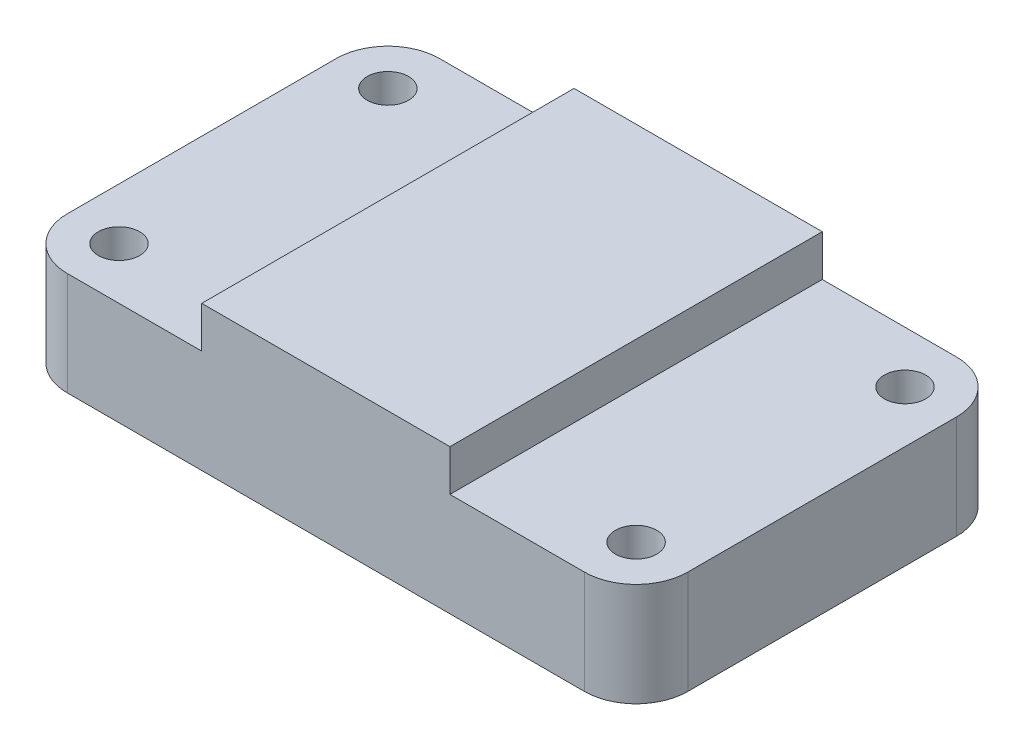
ISO-10303-21;
HEADER;
FILE_DESCRIPTION(('STEP AP214'),'2;1');
FILE_NAME('part.step','',(''),(''),'','','');
FILE_SCHEMA(('AUTOMOTIVE_DESIGN { 1 0 10303 214 1 1 1 1 }'));
ENDSEC;
DATA;
#1=APPLICATION_CONTEXT('core data for automotive mechanical design processes');
#2=APPLICATION_PROTOCOL_DEFINITION('international standard','automotive_design',2000,#1);
#3=PRODUCT_CONTEXT('',#1,'mechanical');
#4=PRODUCT('Part','Part','',(#3));
#5=PRODUCT_RELATED_PRODUCT_CATEGORY('part','',(#4));
#6=PRODUCT_DEFINITION_FORMATION('','',#4);
#7=PRODUCT_DEFINITION_CONTEXT('part definition',#1,'design');
#8=PRODUCT_DEFINITION('design','',#6,#7);
#9=PRODUCT_DEFINITION_SHAPE('','',#8);
#10=(LENGTH_UNIT() NAMED_UNIT(*) SI_UNIT(.MILLI.,.METRE.));
#11=(NAMED_UNIT(*) PLANE_ANGLE_UNIT() SI_UNIT($,.RADIAN.));
#12=(NAMED_UNIT(*) SI_UNIT($,.STERADIAN.) SOLID_ANGLE_UNIT());
#13=UNCERTAINTY_MEASURE_WITH_UNIT(LENGTH_MEASURE(1.E-05),#10,'distance_accuracy_value','');
#14=(GEOMETRIC_REPRESENTATION_CONTEXT(3) GLOBAL_UNCERTAINTY_ASSIGNED_CONTEXT((#13)) GLOBAL_UNIT_ASSIGNED_CONTEXT((#10,
#11,#12)) REPRESENTATION_CONTEXT('',''));
#15=CARTESIAN_POINT('',(0.,0.,0.));
#16=DIRECTION('',(0.,0.,1.));
#17=DIRECTION('',(1.,0.,0.));
#18=AXIS2_PLACEMENT_3D('',#15,#16,#17);
#19=CARTESIAN_POINT('',(0.,50.,-90.));
#20=DIRECTION('',(0.,0.,1.));
#21=DIRECTION('',(1.,0.,0.));
#22=AXIS2_PLACEMENT_3D('',#19,#20,#21);
#23=PLANE('',#22);
#24=DIRECTION('',(-1.,0.,0.));
#25=VECTOR('',#24,1.);
#26=CARTESIAN_POINT('',(0.,0.,-90.));
#27=LINE('',#26,#25);
#28=CARTESIAN_POINT('',(125.,0.,-90.));
#29=VERTEX_POINT('',#28);
#30=CARTESIAN_POINT('',(-125.,0.,-90.));
#31=VERTEX_POINT('',#30);
#32=EDGE_CURVE('E132',#29,#31,#27,.T.);
#33=ORIENTED_EDGE('',*,*,#32,.T.);
#34=DIRECTION('',(0.,-1.,0.));
#35=VECTOR('',#34,1.);
#36=CARTESIAN_POINT('',(-125.,50.,-90.));
#37=LINE('',#36,#35);
#38=CARTESIAN_POINT('',(-125.,50.,-90.));
#39=VERTEX_POINT('',#38);
#40=EDGE_CURVE('E11',#39,#31,#37,.T.);
#41=ORIENTED_EDGE('',*,*,#40,.F.);
#42=DIRECTION('',(-1.,0.,0.));
#43=VECTOR('',#42,1.);
#44=CARTESIAN_POINT('',(0.,50.,-90.));
#45=LINE('',#44,#43);
#46=CARTESIAN_POINT('',(-60.,50.,-90.));
#47=VERTEX_POINT('',#46);
#48=EDGE_CURVE('E62',#47,#39,#45,.T.);
#49=ORIENTED_EDGE('',*,*,#48,.F.);
#50=DIRECTION('',(0.,-1.,0.));
#51=VECTOR('',#50,1.);
#52=CARTESIAN_POINT('',(-60.,70.,-90.));
#53=LINE('',#52,#51);
#54=CARTESIAN_POINT('',(-60.,70.,-90.));
#55=VERTEX_POINT('',#54);
#56=EDGE_CURVE('E200',#55,#47,#53,.T.);
#57=ORIENTED_EDGE('',*,*,#56,.F.);
#58=DIRECTION('',(-1.,0.,0.));
#59=VECTOR('',#58,1.);
#60=CARTESIAN_POINT('',(0.,70.,-90.));
#61=LINE('',#60,#59);
#62=CARTESIAN_POINT('',(60.,70.,-90.));
#63=VERTEX_POINT('',#62);
#64=EDGE_CURVE('E186',#63,#55,#61,.T.);
#65=ORIENTED_EDGE('',*,*,#64,.F.);
#66=DIRECTION('',(0.,-1.,0.));
#67=VECTOR('',#66,1.);
#68=CARTESIAN_POINT('',(60.,70.,-90.));
#69=LINE('',#68,#67);
#70=CARTESIAN_POINT('',(60.,50.,-90.));
#71=VERTEX_POINT('',#70);
#72=EDGE_CURVE('E129',#63,#71,#69,.T.);
#73=ORIENTED_EDGE('',*,*,#72,.T.);
#74=DIRECTION('',(-1.,0.,0.));
#75=VECTOR('',#74,1.);
#76=CARTESIAN_POINT('',(0.,50.,-90.));
#77=LINE('',#76,#75);
#78=CARTESIAN_POINT('',(125.,50.,-90.));
#79=VERTEX_POINT('',#78);
#80=EDGE_CURVE('E237',#79,#71,#77,.T.);
#81=ORIENTED_EDGE('',*,*,#80,.F.);
#82=DIRECTION('',(0.,-1.,0.));
#83=VECTOR('',#82,1.);
#84=CARTESIAN_POINT('',(125.,50.,-90.));
#85=LINE('',#84,#83);
#86=EDGE_CURVE('E172',#79,#29,#85,.T.);
#87=ORIENTED_EDGE('',*,*,#86,.T.);
#88=EDGE_LOOP('',(#33,#41,#49,#57,#65,#73,#81,#87));
#89=FACE_BOUND('',#88,.T.);
#90=ADVANCED_FACE('F38',(#89),#23,.F.);
#91=CARTESIAN_POINT('',(-125.,50.,-65.));
#92=DIRECTION('',(0.,-1.,0.));
#93=DIRECTION('',(0.,0.,-1.));
#94=AXIS2_PLACEMENT_3D('',#91,#92,#93);
#95=CYLINDRICAL_SURFACE('',#94,25.);
#96=CARTESIAN_POINT('',(-125.,0.,-65.));
#97=DIRECTION('',(0.,1.,0.));
#98=DIRECTION('',(0.,0.,1.));
#99=AXIS2_PLACEMENT_3D('',#96,#97,#98);
#100=CIRCLE('',#99,25.);
#101=CARTESIAN_POINT('',(-150.,0.,-65.));
#102=VERTEX_POINT('',#101);
#103=EDGE_CURVE('E135',#31,#102,#100,.T.);
#104=ORIENTED_EDGE('',*,*,#103,.T.);
#105=DIRECTION('',(0.,-1.,0.));
#106=VECTOR('',#105,1.);
#107=CARTESIAN_POINT('',(-150.,50.,-65.));
#108=LINE('',#107,#106);
#109=CARTESIAN_POINT('',(-150.,50.,-65.));
#110=VERTEX_POINT('',#109);
#111=EDGE_CURVE('E46',#110,#102,#108,.T.);
#112=ORIENTED_EDGE('',*,*,#111,.F.);
#113=CARTESIAN_POINT('',(-125.,50.,-65.));
#114=DIRECTION('',(0.,1.,0.));
#115=DIRECTION('',(0.,0.,1.));
#116=AXIS2_PLACEMENT_3D('',#113,#114,#115);
#117=CIRCLE('',#116,25.);
#118=EDGE_CURVE('E92',#39,#110,#117,.T.);
#119=ORIENTED_EDGE('',*,*,#118,.F.);
#120=ORIENTED_EDGE('',*,*,#40,.T.);
#121=EDGE_LOOP('',(#104,#112,#119,#120));
#122=FACE_BOUND('',#121,.T.);
#123=ADVANCED_FACE('F145',(#122),#95,.T.);
#124=CARTESIAN_POINT('',(-150.,50.,0.));
#125=DIRECTION('',(-1.,0.,0.));
#126=DIRECTION('',(0.,0.,1.));
#127=AXIS2_PLACEMENT_3D('',#124,#125,#126);
#128=PLANE('',#127);
#129=DIRECTION('',(0.,0.,-1.));
#130=VECTOR('',#129,1.);
#131=CARTESIAN_POINT('',(-150.,0.,0.));
#132=LINE('',#131,#130);
#133=CARTESIAN_POINT('',(-150.,0.,65.));
#134=VERTEX_POINT('',#133);
#135=EDGE_CURVE('E105',#134,#102,#132,.T.);
#136=ORIENTED_EDGE('',*,*,#135,.F.);
#137=DIRECTION('',(0.,-1.,0.));
#138=VECTOR('',#137,1.);
#139=CARTESIAN_POINT('',(-150.,50.,65.));
#140=LINE('',#139,#138);
#141=CARTESIAN_POINT('',(-150.,50.,65.));
#142=VERTEX_POINT('',#141);
#143=EDGE_CURVE('E100',#142,#134,#140,.T.);
#144=ORIENTED_EDGE('',*,*,#143,.F.);
#145=DIRECTION('',(0.,0.,-1.));
#146=VECTOR('',#145,1.);
#147=CARTESIAN_POINT('',(-150.,50.,0.));
#148=LINE('',#147,#146);
#149=EDGE_CURVE('E103',#142,#110,#148,.T.);
#150=ORIENTED_EDGE('',*,*,#149,.T.);
#151=ORIENTED_EDGE('',*,*,#111,.T.);
#152=EDGE_LOOP('',(#136,#144,#150,#151));
#153=FACE_BOUND('',#152,.T.);
#154=ADVANCED_FACE('F102',(#153),#128,.T.);
#155=CARTESIAN_POINT('',(-125.,50.,65.));
#156=DIRECTION('',(0.,-1.,0.));
#157=DIRECTION('',(0.,0.,-1.));
#158=AXIS2_PLACEMENT_3D('',#155,#156,#157);
#159=CYLINDRICAL_SURFACE('',#158,25.);
#160=CARTESIAN_POINT('',(-125.,0.,65.));
#161=DIRECTION('',(0.,1.,0.));
#162=DIRECTION('',(0.,0.,1.));
#163=AXIS2_PLACEMENT_3D('',#160,#161,#162);
#164=CIRCLE('',#163,25.);
#165=CARTESIAN_POINT('',(-125.,0.,90.));
#166=VERTEX_POINT('',#165);
#167=EDGE_CURVE('E139',#166,#134,#164,.F.);
#168=ORIENTED_EDGE('',*,*,#167,.F.);
#169=DIRECTION('',(0.,-1.,0.));
#170=VECTOR('',#169,1.);
#171=CARTESIAN_POINT('',(-125.,50.,90.));
#172=LINE('',#171,#170);
#173=CARTESIAN_POINT('',(-125.,50.,90.));
#174=VERTEX_POINT('',#173);
#175=EDGE_CURVE('E84',#174,#166,#172,.T.);
#176=ORIENTED_EDGE('',*,*,#175,.F.);
#177=CARTESIAN_POINT('',(-125.,50.,65.));
#178=DIRECTION('',(0.,1.,0.));
#179=DIRECTION('',(0.,0.,1.));
#180=AXIS2_PLACEMENT_3D('',#177,#178,#179);
#181=CIRCLE('',#180,25.);
#182=EDGE_CURVE('E114',#174,#142,#181,.F.);
#183=ORIENTED_EDGE('',*,*,#182,.T.);
#184=ORIENTED_EDGE('',*,*,#143,.T.);
#185=EDGE_LOOP('',(#168,#176,#183,#184));
#186=FACE_BOUND('',#185,.T.);
#187=ADVANCED_FACE('F116',(#186),#159,.T.);
#188=CARTESIAN_POINT('',(0.,50.,90.));
#189=DIRECTION('',(0.,0.,1.));
#190=DIRECTION('',(1.,0.,0.));
#191=AXIS2_PLACEMENT_3D('',#188,#189,#190);
#192=PLANE('',#191);
#193=DIRECTION('',(-1.,0.,0.));
#194=VECTOR('',#193,1.);
#195=CARTESIAN_POINT('',(0.,0.,90.));
#196=LINE('',#195,#194);
#197=CARTESIAN_POINT('',(125.,0.,90.));
#198=VERTEX_POINT('',#197);
#199=EDGE_CURVE('E141',#198,#166,#196,.T.);
#200=ORIENTED_EDGE('',*,*,#199,.F.);
#201=DIRECTION('',(0.,-1.,0.));
#202=VECTOR('',#201,1.);
#203=CARTESIAN_POINT('',(125.,50.,90.));
#204=LINE('',#203,#202);
#205=CARTESIAN_POINT('',(125.,50.,90.));
#206=VERTEX_POINT('',#205);
#207=EDGE_CURVE('E160',#206,#198,#204,.T.);
#208=ORIENTED_EDGE('',*,*,#207,.F.);
#209=DIRECTION('',(-1.,0.,0.));
#210=VECTOR('',#209,1.);
#211=CARTESIAN_POINT('',(0.,50.,90.));
#212=LINE('',#211,#210);
#213=CARTESIAN_POINT('',(60.,50.,90.));
#214=VERTEX_POINT('',#213);
#215=EDGE_CURVE('E234',#206,#214,#212,.T.);
#216=ORIENTED_EDGE('',*,*,#215,.T.);
#217=DIRECTION('',(0.,-1.,0.));
#218=VECTOR('',#217,1.);
#219=CARTESIAN_POINT('',(60.,70.,90.));
#220=LINE('',#219,#218);
#221=CARTESIAN_POINT('',(60.,70.,90.));
#222=VERTEX_POINT('',#221);
#223=EDGE_CURVE('E195',#222,#214,#220,.T.);
#224=ORIENTED_EDGE('',*,*,#223,.F.);
#225=DIRECTION('',(-1.,0.,0.));
#226=VECTOR('',#225,1.);
#227=CARTESIAN_POINT('',(0.,70.,90.));
#228=LINE('',#227,#226);
#229=CARTESIAN_POINT('',(-60.,70.,90.));
#230=VERTEX_POINT('',#229);
#231=EDGE_CURVE('E192',#222,#230,#228,.T.);
#232=ORIENTED_EDGE('',*,*,#231,.T.);
#233=DIRECTION('',(0.,-1.,0.));
#234=VECTOR('',#233,1.);
#235=CARTESIAN_POINT('',(-60.,70.,90.));
#236=LINE('',#235,#234);
#237=CARTESIAN_POINT('',(-60.,50.,90.));
#238=VERTEX_POINT('',#237);
#239=EDGE_CURVE('E197',#230,#238,#236,.T.);
#240=ORIENTED_EDGE('',*,*,#239,.T.);
#241=DIRECTION('',(-1.,0.,0.));
#242=VECTOR('',#241,1.);
#243=CARTESIAN_POINT('',(0.,50.,90.));
#244=LINE('',#243,#242);
#245=EDGE_CURVE('E117',#238,#174,#244,.T.);
#246=ORIENTED_EDGE('',*,*,#245,.T.);
#247=ORIENTED_EDGE('',*,*,#175,.T.);
#248=EDGE_LOOP('',(#200,#208,#216,#224,#232,#240,#246,#247));
#249=FACE_BOUND('',#248,.T.);
#250=ADVANCED_FACE('F157',(#249),#192,.T.);
#251=CARTESIAN_POINT('',(-125.,50.,-65.));
#252=DIRECTION('',(0.,-1.,0.));
#253=DIRECTION('',(0.,0.,-1.));
#254=AXIS2_PLACEMENT_3D('',#251,#252,#253);
#255=CYLINDRICAL_SURFACE('',#254,9.99999999999999);
#256=CARTESIAN_POINT('',(-125.,50.,-65.));
#257=DIRECTION('',(0.,1.,0.));
#258=DIRECTION('',(0.,0.,1.));
#259=AXIS2_PLACEMENT_3D('',#256,#257,#258);
#260=CIRCLE('',#259,9.99999999999999);
#261=CARTESIAN_POINT('',(-125.,50.,-55.));
#262=VERTEX_POINT('',#261);
#263=EDGE_CURVE('E206',#262,#262,#260,.T.);
#264=ORIENTED_EDGE('',*,*,#263,.T.);
#265=EDGE_LOOP('',(#264));
#266=FACE_BOUND('',#265,.T.);
#267=CARTESIAN_POINT('',(-125.,0.,-65.));
#268=DIRECTION('',(0.,1.,0.));
#269=DIRECTION('',(0.,0.,1.));
#270=AXIS2_PLACEMENT_3D('',#267,#268,#269);
#271=CIRCLE('',#270,9.99999999999999);
#272=CARTESIAN_POINT('',(-125.,0.,-55.));
#273=VERTEX_POINT('',#272);
#274=EDGE_CURVE('E128',#273,#273,#271,.T.);
#275=ORIENTED_EDGE('',*,*,#274,.F.);
#276=EDGE_LOOP('',(#275));
#277=FACE_BOUND('',#276,.T.);
#278=ADVANCED_FACE('F308',(#266,#277),#255,.F.);
#279=CARTESIAN_POINT('',(-125.,50.,65.));
#280=DIRECTION('',(0.,-1.,0.));
#281=DIRECTION('',(0.,0.,-1.));
#282=AXIS2_PLACEMENT_3D('',#279,#280,#281);
#283=CYLINDRICAL_SURFACE('',#282,10.);
#284=CARTESIAN_POINT('',(-125.,50.,65.));
#285=DIRECTION('',(0.,1.,0.));
#286=DIRECTION('',(0.,0.,1.));
#287=AXIS2_PLACEMENT_3D('',#284,#285,#286);
#288=CIRCLE('',#287,10.);
#289=CARTESIAN_POINT('',(-125.,50.,75.));
#290=VERTEX_POINT('',#289);
#291=EDGE_CURVE('E144',#290,#290,#288,.T.);
#292=ORIENTED_EDGE('',*,*,#291,.T.);
#293=EDGE_LOOP('',(#292));
#294=FACE_BOUND('',#293,.T.);
#295=CARTESIAN_POINT('',(-125.,0.,65.));
#296=DIRECTION('',(0.,1.,0.));
#297=DIRECTION('',(0.,0.,1.));
#298=AXIS2_PLACEMENT_3D('',#295,#296,#297);
#299=CIRCLE('',#298,10.);
#300=CARTESIAN_POINT('',(-125.,0.,75.));
#301=VERTEX_POINT('',#300);
#302=EDGE_CURVE('E125',#301,#301,#299,.T.);
#303=ORIENTED_EDGE('',*,*,#302,.F.);
#304=EDGE_LOOP('',(#303));
#305=FACE_BOUND('',#304,.T.);
#306=ADVANCED_FACE('F40',(#294,#305),#283,.F.);
#307=CARTESIAN_POINT('',(0.,50.,0.));
#308=DIRECTION('',(0.,1.,0.));
#309=DIRECTION('',(0.,0.,1.));
#310=AXIS2_PLACEMENT_3D('',#307,#308,#309);
#311=PLANE('',#310);
#312=ORIENTED_EDGE('',*,*,#291,.F.);
#313=EDGE_LOOP('',(#312));
#314=FACE_BOUND('',#313,.T.);
#315=ORIENTED_EDGE('',*,*,#263,.F.);
#316=EDGE_LOOP('',(#315));
#317=FACE_BOUND('',#316,.T.);
#318=ORIENTED_EDGE('',*,*,#48,.T.);
#319=ORIENTED_EDGE('',*,*,#118,.T.);
#320=ORIENTED_EDGE('',*,*,#149,.F.);
#321=ORIENTED_EDGE('',*,*,#182,.F.);
#322=ORIENTED_EDGE('',*,*,#245,.F.);
#323=DIRECTION('',(0.,0.,1.));
#324=VECTOR('',#323,1.);
#325=CARTESIAN_POINT('',(-60.,50.,0.));
#326=LINE('',#325,#324);
#327=EDGE_CURVE('E119',#47,#238,#326,.T.);
#328=ORIENTED_EDGE('',*,*,#327,.F.);
#329=EDGE_LOOP('',(#318,#319,#320,#321,#322,#328));
#330=FACE_BOUND('',#329,.T.);
#331=ADVANCED_FACE('F112',(#314,#317,#330),#311,.T.);
#332=CARTESIAN_POINT('',(0.,0.,0.));
#333=DIRECTION('',(0.,1.,0.));
#334=DIRECTION('',(0.,0.,1.));
#335=AXIS2_PLACEMENT_3D('',#332,#333,#334);
#336=PLANE('',#335);
#337=ORIENTED_EDGE('',*,*,#302,.T.);
#338=EDGE_LOOP('',(#337));
#339=FACE_BOUND('',#338,.T.);
#340=ORIENTED_EDGE('',*,*,#274,.T.);
#341=EDGE_LOOP('',(#340));
#342=FACE_BOUND('',#341,.T.);
#343=ORIENTED_EDGE('',*,*,#32,.F.);
#344=CARTESIAN_POINT('',(125.,0.,-65.));
#345=DIRECTION('',(0.,1.,0.));
#346=DIRECTION('',(0.,0.,1.));
#347=AXIS2_PLACEMENT_3D('',#344,#345,#346);
#348=CIRCLE('',#347,25.);
#349=CARTESIAN_POINT('',(150.,0.,-65.));
#350=VERTEX_POINT('',#349);
#351=EDGE_CURVE('E214',#350,#29,#348,.T.);
#352=ORIENTED_EDGE('',*,*,#351,.F.);
#353=DIRECTION('',(0.,0.,-1.));
#354=VECTOR('',#353,1.);
#355=CARTESIAN_POINT('',(150.,0.,0.));
#356=LINE('',#355,#354);
#357=CARTESIAN_POINT('',(150.,0.,65.));
#358=VERTEX_POINT('',#357);
#359=EDGE_CURVE('E222',#358,#350,#356,.T.);
#360=ORIENTED_EDGE('',*,*,#359,.F.);
#361=CARTESIAN_POINT('',(125.,0.,65.));
#362=DIRECTION('',(0.,1.,0.));
#363=DIRECTION('',(0.,0.,1.));
#364=AXIS2_PLACEMENT_3D('',#361,#362,#363);
#365=CIRCLE('',#364,25.);
#366=EDGE_CURVE('E154',#198,#358,#365,.T.);
#367=ORIENTED_EDGE('',*,*,#366,.F.);
#368=ORIENTED_EDGE('',*,*,#199,.T.);
#369=ORIENTED_EDGE('',*,*,#167,.T.);
#370=ORIENTED_EDGE('',*,*,#135,.T.);
#371=ORIENTED_EDGE('',*,*,#103,.F.);
#372=EDGE_LOOP('',(#343,#352,#360,#367,#368,#369,#370,#371));
#373=FACE_BOUND('',#372,.T.);
#374=CARTESIAN_POINT('',(125.,0.,65.));
#375=DIRECTION('',(0.,1.,0.));
#376=DIRECTION('',(0.,0.,1.));
#377=AXIS2_PLACEMENT_3D('',#374,#375,#376);
#378=CIRCLE('',#377,10.);
#379=CARTESIAN_POINT('',(125.,0.,75.));
#380=VERTEX_POINT('',#379);
#381=EDGE_CURVE('E230',#380,#380,#378,.T.);
#382=ORIENTED_EDGE('',*,*,#381,.T.);
#383=EDGE_LOOP('',(#382));
#384=FACE_BOUND('',#383,.T.);
#385=CARTESIAN_POINT('',(125.,0.,-65.));
#386=DIRECTION('',(0.,1.,0.));
#387=DIRECTION('',(0.,0.,1.));
#388=AXIS2_PLACEMENT_3D('',#385,#386,#387);
#389=CIRCLE('',#388,10.);
#390=CARTESIAN_POINT('',(125.,0.,-55.));
#391=VERTEX_POINT('',#390);
#392=EDGE_CURVE('E225',#391,#391,#389,.T.);
#393=ORIENTED_EDGE('',*,*,#392,.T.);
#394=EDGE_LOOP('',(#393));
#395=FACE_BOUND('',#394,.T.);
#396=ADVANCED_FACE('F148',(#339,#342,#373,#384,#395),#336,.F.);
#397=CARTESIAN_POINT('',(-60.,70.,0.));
#398=DIRECTION('',(1.,0.,0.));
#399=DIRECTION('',(0.,0.,-1.));
#400=AXIS2_PLACEMENT_3D('',#397,#398,#399);
#401=PLANE('',#400);
#402=ORIENTED_EDGE('',*,*,#56,.T.);
#403=ORIENTED_EDGE('',*,*,#327,.T.);
#404=ORIENTED_EDGE('',*,*,#239,.F.);
#405=DIRECTION('',(0.,0.,1.));
#406=VECTOR('',#405,1.);
#407=CARTESIAN_POINT('',(-60.,70.,0.));
#408=LINE('',#407,#406);
#409=EDGE_CURVE('E189',#55,#230,#408,.T.);
#410=ORIENTED_EDGE('',*,*,#409,.F.);
#411=EDGE_LOOP('',(#402,#403,#404,#410));
#412=FACE_BOUND('',#411,.T.);
#413=ADVANCED_FACE('F279',(#412),#401,.F.);
#414=CARTESIAN_POINT('',(60.,70.,0.));
#415=DIRECTION('',(1.,0.,0.));
#416=DIRECTION('',(0.,0.,-1.));
#417=AXIS2_PLACEMENT_3D('',#414,#415,#416);
#418=PLANE('',#417);
#419=DIRECTION('',(0.,0.,1.));
#420=VECTOR('',#419,1.);
#421=CARTESIAN_POINT('',(60.,50.,0.));
#422=LINE('',#421,#420);
#423=EDGE_CURVE('E53',#71,#214,#422,.T.);
#424=ORIENTED_EDGE('',*,*,#423,.F.);
#425=ORIENTED_EDGE('',*,*,#72,.F.);
#426=DIRECTION('',(0.,0.,1.));
#427=VECTOR('',#426,1.);
#428=CARTESIAN_POINT('',(60.,70.,0.));
#429=LINE('',#428,#427);
#430=EDGE_CURVE('E183',#63,#222,#429,.T.);
#431=ORIENTED_EDGE('',*,*,#430,.T.);
#432=ORIENTED_EDGE('',*,*,#223,.T.);
#433=EDGE_LOOP('',(#424,#425,#431,#432));
#434=FACE_BOUND('',#433,.T.);
#435=ADVANCED_FACE('F291',(#434),#418,.T.);
#436=CARTESIAN_POINT('',(0.,70.,0.));
#437=DIRECTION('',(0.,1.,0.));
#438=DIRECTION('',(0.,0.,1.));
#439=AXIS2_PLACEMENT_3D('',#436,#437,#438);
#440=PLANE('',#439);
#441=ORIENTED_EDGE('',*,*,#430,.F.);
#442=ORIENTED_EDGE('',*,*,#64,.T.);
#443=ORIENTED_EDGE('',*,*,#409,.T.);
#444=ORIENTED_EDGE('',*,*,#231,.F.);
#445=EDGE_LOOP('',(#441,#442,#443,#444));
#446=FACE_BOUND('',#445,.T.);
#447=ADVANCED_FACE('F284',(#446),#440,.T.);
#448=CARTESIAN_POINT('',(150.,50.,0.));
#449=DIRECTION('',(-1.,0.,0.));
#450=DIRECTION('',(0.,0.,1.));
#451=AXIS2_PLACEMENT_3D('',#448,#449,#450);
#452=PLANE('',#451);
#453=ORIENTED_EDGE('',*,*,#359,.T.);
#454=DIRECTION('',(0.,-1.,0.));
#455=VECTOR('',#454,1.);
#456=CARTESIAN_POINT('',(150.,50.,-65.));
#457=LINE('',#456,#455);
#458=CARTESIAN_POINT('',(150.,50.,-65.));
#459=VERTEX_POINT('',#458);
#460=EDGE_CURVE('E176',#459,#350,#457,.T.);
#461=ORIENTED_EDGE('',*,*,#460,.F.);
#462=DIRECTION('',(0.,0.,-1.));
#463=VECTOR('',#462,1.);
#464=CARTESIAN_POINT('',(150.,50.,0.));
#465=LINE('',#464,#463);
#466=CARTESIAN_POINT('',(150.,50.,65.));
#467=VERTEX_POINT('',#466);
#468=EDGE_CURVE('E243',#467,#459,#465,.T.);
#469=ORIENTED_EDGE('',*,*,#468,.F.);
#470=DIRECTION('',(0.,-1.,0.));
#471=VECTOR('',#470,1.);
#472=CARTESIAN_POINT('',(150.,50.,65.));
#473=LINE('',#472,#471);
#474=EDGE_CURVE('E173',#467,#358,#473,.T.);
#475=ORIENTED_EDGE('',*,*,#474,.T.);
#476=EDGE_LOOP('',(#453,#461,#469,#475));
#477=FACE_BOUND('',#476,.T.);
#478=ADVANCED_FACE('F266',(#477),#452,.F.);
#479=CARTESIAN_POINT('',(125.,50.,-65.));
#480=DIRECTION('',(0.,-1.,0.));
#481=DIRECTION('',(0.,0.,-1.));
#482=AXIS2_PLACEMENT_3D('',#479,#480,#481);
#483=CYLINDRICAL_SURFACE('',#482,25.);
#484=ORIENTED_EDGE('',*,*,#351,.T.);
#485=ORIENTED_EDGE('',*,*,#86,.F.);
#486=CARTESIAN_POINT('',(125.,50.,-65.));
#487=DIRECTION('',(0.,1.,0.));
#488=DIRECTION('',(0.,0.,1.));
#489=AXIS2_PLACEMENT_3D('',#486,#487,#488);
#490=CIRCLE('',#489,25.);
#491=EDGE_CURVE('E240',#459,#79,#490,.T.);
#492=ORIENTED_EDGE('',*,*,#491,.F.);
#493=ORIENTED_EDGE('',*,*,#460,.T.);
#494=EDGE_LOOP('',(#484,#485,#492,#493));
#495=FACE_BOUND('',#494,.T.);
#496=ADVANCED_FACE('F217',(#495),#483,.T.);
#497=CARTESIAN_POINT('',(125.,50.,-65.));
#498=DIRECTION('',(0.,-1.,0.));
#499=DIRECTION('',(0.,0.,-1.));
#500=AXIS2_PLACEMENT_3D('',#497,#498,#499);
#501=CYLINDRICAL_SURFACE('',#500,10.);
#502=CARTESIAN_POINT('',(125.,50.,-65.));
#503=DIRECTION('',(0.,1.,0.));
#504=DIRECTION('',(0.,0.,1.));
#505=AXIS2_PLACEMENT_3D('',#502,#503,#504);
#506=CIRCLE('',#505,10.);
#507=CARTESIAN_POINT('',(125.,50.,-55.));
#508=VERTEX_POINT('',#507);
#509=EDGE_CURVE('E246',#508,#508,#506,.T.);
#510=ORIENTED_EDGE('',*,*,#509,.T.);
#511=EDGE_LOOP('',(#510));
#512=FACE_BOUND('',#511,.T.);
#513=ORIENTED_EDGE('',*,*,#392,.F.);
#514=EDGE_LOOP('',(#513));
#515=FACE_BOUND('',#514,.T.);
#516=ADVANCED_FACE('F393',(#512,#515),#501,.F.);
#517=CARTESIAN_POINT('',(125.,50.,65.));
#518=DIRECTION('',(0.,-1.,0.));
#519=DIRECTION('',(0.,0.,-1.));
#520=AXIS2_PLACEMENT_3D('',#517,#518,#519);
#521=CYLINDRICAL_SURFACE('',#520,10.);
#522=CARTESIAN_POINT('',(125.,50.,65.));
#523=DIRECTION('',(0.,1.,0.));
#524=DIRECTION('',(0.,0.,1.));
#525=AXIS2_PLACEMENT_3D('',#522,#523,#524);
#526=CIRCLE('',#525,10.);
#527=CARTESIAN_POINT('',(125.,50.,75.));
#528=VERTEX_POINT('',#527);
#529=EDGE_CURVE('E224',#528,#528,#526,.T.);
#530=ORIENTED_EDGE('',*,*,#529,.T.);
#531=EDGE_LOOP('',(#530));
#532=FACE_BOUND('',#531,.T.);
#533=ORIENTED_EDGE('',*,*,#381,.F.);
#534=EDGE_LOOP('',(#533));
#535=FACE_BOUND('',#534,.T.);
#536=ADVANCED_FACE('F252',(#532,#535),#521,.F.);
#537=CARTESIAN_POINT('',(125.,50.,65.));
#538=DIRECTION('',(0.,-1.,0.));
#539=DIRECTION('',(0.,0.,-1.));
#540=AXIS2_PLACEMENT_3D('',#537,#538,#539);
#541=CYLINDRICAL_SURFACE('',#540,25.);
#542=ORIENTED_EDGE('',*,*,#366,.T.);
#543=ORIENTED_EDGE('',*,*,#474,.F.);
#544=CARTESIAN_POINT('',(125.,50.,65.));
#545=DIRECTION('',(0.,1.,0.));
#546=DIRECTION('',(0.,0.,1.));
#547=AXIS2_PLACEMENT_3D('',#544,#545,#546);
#548=CIRCLE('',#547,25.);
#549=EDGE_CURVE('E170',#206,#467,#548,.T.);
#550=ORIENTED_EDGE('',*,*,#549,.F.);
#551=ORIENTED_EDGE('',*,*,#207,.T.);
#552=EDGE_LOOP('',(#542,#543,#550,#551));
#553=FACE_BOUND('',#552,.T.);
#554=ADVANCED_FACE('F166',(#553),#541,.T.);
#555=CARTESIAN_POINT('',(0.,50.,0.));
#556=DIRECTION('',(0.,1.,0.));
#557=DIRECTION('',(0.,0.,1.));
#558=AXIS2_PLACEMENT_3D('',#555,#556,#557);
#559=PLANE('',#558);
#560=ORIENTED_EDGE('',*,*,#529,.F.);
#561=EDGE_LOOP('',(#560));
#562=FACE_BOUND('',#561,.T.);
#563=ORIENTED_EDGE('',*,*,#509,.F.);
#564=EDGE_LOOP('',(#563));
#565=FACE_BOUND('',#564,.T.);
#566=ORIENTED_EDGE('',*,*,#468,.T.);
#567=ORIENTED_EDGE('',*,*,#491,.T.);
#568=ORIENTED_EDGE('',*,*,#80,.T.);
#569=ORIENTED_EDGE('',*,*,#423,.T.);
#570=ORIENTED_EDGE('',*,*,#215,.F.);
#571=ORIENTED_EDGE('',*,*,#549,.T.);
#572=EDGE_LOOP('',(#566,#567,#568,#569,#570,#571));
#573=FACE_BOUND('',#572,.T.);
#574=ADVANCED_FACE('F255',(#562,#565,#573),#559,.T.);
#575=CLOSED_SHELL('',(#90,#123,#154,#187,#250,#278,#306,#331,#396,#413,#435,#447,#478,#496,#516,
#536,#554,#574));
#576=MANIFOLD_SOLID_BREP('B2',#575);
#577=ADVANCED_BREP_SHAPE_REPRESENTATION('',(#18,#576),#14);
#578=SHAPE_DEFINITION_REPRESENTATION(#9,#577);
ENDSEC;
END-ISO-10303-21;
